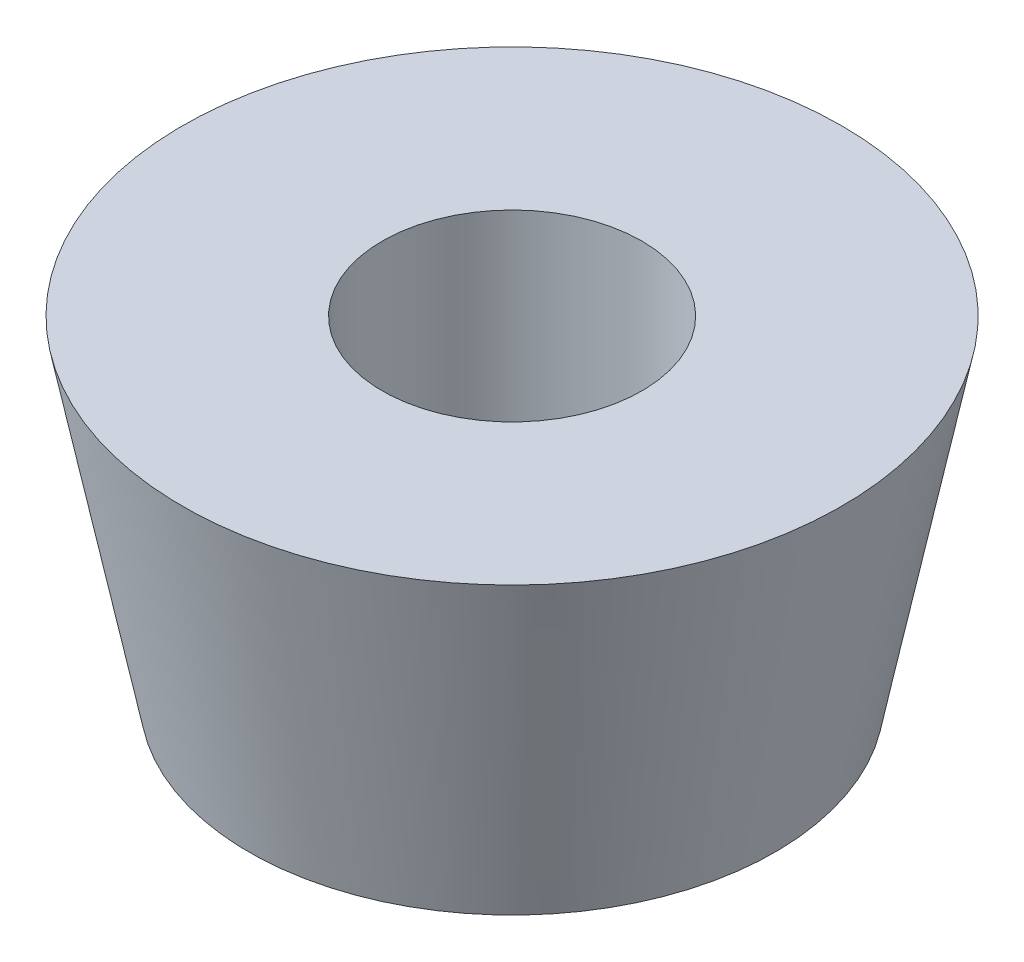
ISO-10303-21;
HEADER;
FILE_DESCRIPTION(('STEP AP214'),'2;1');
FILE_NAME('part.step','',(''),(''),'','','');
FILE_SCHEMA(('AUTOMOTIVE_DESIGN { 1 0 10303 214 1 1 1 1 }'));
ENDSEC;
DATA;
#1=APPLICATION_CONTEXT('core data for automotive mechanical design processes');
#2=APPLICATION_PROTOCOL_DEFINITION('international standard','automotive_design',2000,#1);
#3=PRODUCT_CONTEXT('',#1,'mechanical');
#4=PRODUCT('Part','Part','',(#3));
#5=PRODUCT_RELATED_PRODUCT_CATEGORY('part','',(#4));
#6=PRODUCT_DEFINITION_FORMATION('','',#4);
#7=PRODUCT_DEFINITION_CONTEXT('part definition',#1,'design');
#8=PRODUCT_DEFINITION('design','',#6,#7);
#9=PRODUCT_DEFINITION_SHAPE('','',#8);
#10=(LENGTH_UNIT() NAMED_UNIT(*) SI_UNIT(.MILLI.,.METRE.));
#11=(NAMED_UNIT(*) PLANE_ANGLE_UNIT() SI_UNIT($,.RADIAN.));
#12=(NAMED_UNIT(*) SI_UNIT($,.STERADIAN.) SOLID_ANGLE_UNIT());
#13=UNCERTAINTY_MEASURE_WITH_UNIT(LENGTH_MEASURE(1.E-05),#10,'distance_accuracy_value','');
#14=(GEOMETRIC_REPRESENTATION_CONTEXT(3) GLOBAL_UNCERTAINTY_ASSIGNED_CONTEXT((#13)) GLOBAL_UNIT_ASSIGNED_CONTEXT((#10,
#11,#12)) REPRESENTATION_CONTEXT('',''));
#15=CARTESIAN_POINT('',(0.,0.,0.));
#16=DIRECTION('',(0.,0.,1.));
#17=DIRECTION('',(1.,0.,0.));
#18=AXIS2_PLACEMENT_3D('',#15,#16,#17);
#19=CARTESIAN_POINT('',(0.,0.,0.));
#20=DIRECTION('',(0.,-1.,0.));
#21=DIRECTION('',(0.,0.,-1.));
#22=AXIS2_PLACEMENT_3D('',#19,#20,#21);
#23=CYLINDRICAL_SURFACE('',#22,1.95);
#24=CARTESIAN_POINT('',(0.,0.,0.));
#25=DIRECTION('',(0.,-1.,0.));
#26=DIRECTION('',(0.,0.,-1.));
#27=AXIS2_PLACEMENT_3D('',#24,#25,#26);
#28=CIRCLE('',#27,1.95);
#29=CARTESIAN_POINT('',(0.,0.,-1.95));
#30=VERTEX_POINT('',#29);
#31=EDGE_CURVE('E10',#30,#30,#28,.T.);
#32=ORIENTED_EDGE('',*,*,#31,.T.);
#33=EDGE_LOOP('',(#32));
#34=FACE_BOUND('',#33,.T.);
#35=CARTESIAN_POINT('',(0.,5.,0.));
#36=DIRECTION('',(0.,-1.,0.));
#37=DIRECTION('',(0.,0.,-1.));
#38=AXIS2_PLACEMENT_3D('',#35,#36,#37);
#39=CIRCLE('',#38,1.95);
#40=CARTESIAN_POINT('',(0.,5.,-1.95));
#41=VERTEX_POINT('',#40);
#42=EDGE_CURVE('E52',#41,#41,#39,.T.);
#43=ORIENTED_EDGE('',*,*,#42,.F.);
#44=EDGE_LOOP('',(#43));
#45=FACE_BOUND('',#44,.T.);
#46=ADVANCED_FACE('F39',(#34,#45),#23,.F.);
#47=CARTESIAN_POINT('',(1.95,0.,0.));
#48=DIRECTION('',(0.,-1.,0.));
#49=DIRECTION('',(0.,0.,-1.));
#50=AXIS2_PLACEMENT_3D('',#47,#48,#49);
#51=PLANE('',#50);
#52=CARTESIAN_POINT('',(0.,0.,0.));
#53=DIRECTION('',(0.,-1.,0.));
#54=DIRECTION('',(0.,0.,-1.));
#55=AXIS2_PLACEMENT_3D('',#52,#53,#54);
#56=CIRCLE('',#55,3.95);
#57=CARTESIAN_POINT('',(0.,0.,-3.95));
#58=VERTEX_POINT('',#57);
#59=EDGE_CURVE('E44',#58,#58,#56,.T.);
#60=ORIENTED_EDGE('',*,*,#59,.T.);
#61=EDGE_LOOP('',(#60));
#62=FACE_BOUND('',#61,.T.);
#63=ORIENTED_EDGE('',*,*,#31,.F.);
#64=EDGE_LOOP('',(#63));
#65=FACE_BOUND('',#64,.T.);
#66=ADVANCED_FACE('F64',(#62,#65),#51,.T.);
#67=CARTESIAN_POINT('',(0.,0.,0.));
#68=DIRECTION('',(0.,1.,0.));
#69=DIRECTION('',(0.,0.,1.));
#70=AXIS2_PLACEMENT_3D('',#67,#68,#69);
#71=CONICAL_SURFACE('',#70,3.95,0.197395559849881);
#72=CARTESIAN_POINT('',(0.,5.,0.));
#73=DIRECTION('',(0.,-1.,0.));
#74=DIRECTION('',(0.,0.,-1.));
#75=AXIS2_PLACEMENT_3D('',#72,#73,#74);
#76=CIRCLE('',#75,4.95);
#77=CARTESIAN_POINT('',(0.,5.,-4.95));
#78=VERTEX_POINT('',#77);
#79=EDGE_CURVE('E47',#78,#78,#76,.T.);
#80=ORIENTED_EDGE('',*,*,#79,.T.);
#81=EDGE_LOOP('',(#80));
#82=FACE_BOUND('',#81,.T.);
#83=ORIENTED_EDGE('',*,*,#59,.F.);
#84=EDGE_LOOP('',(#83));
#85=FACE_BOUND('',#84,.T.);
#86=ADVANCED_FACE('F70',(#82,#85),#71,.T.);
#87=CARTESIAN_POINT('',(4.95,5.,0.));
#88=DIRECTION('',(0.,1.,0.));
#89=DIRECTION('',(0.,0.,1.));
#90=AXIS2_PLACEMENT_3D('',#87,#88,#89);
#91=PLANE('',#90);
#92=ORIENTED_EDGE('',*,*,#42,.T.);
#93=EDGE_LOOP('',(#92));
#94=FACE_BOUND('',#93,.T.);
#95=ORIENTED_EDGE('',*,*,#79,.F.);
#96=EDGE_LOOP('',(#95));
#97=FACE_BOUND('',#96,.T.);
#98=ADVANCED_FACE('F56',(#94,#97),#91,.T.);
#99=CLOSED_SHELL('',(#46,#66,#86,#98));
#100=MANIFOLD_SOLID_BREP('B2',#99);
#101=ADVANCED_BREP_SHAPE_REPRESENTATION('',(#18,#100),#14);
#102=SHAPE_DEFINITION_REPRESENTATION(#9,#101);
ENDSEC;
END-ISO-10303-21;
